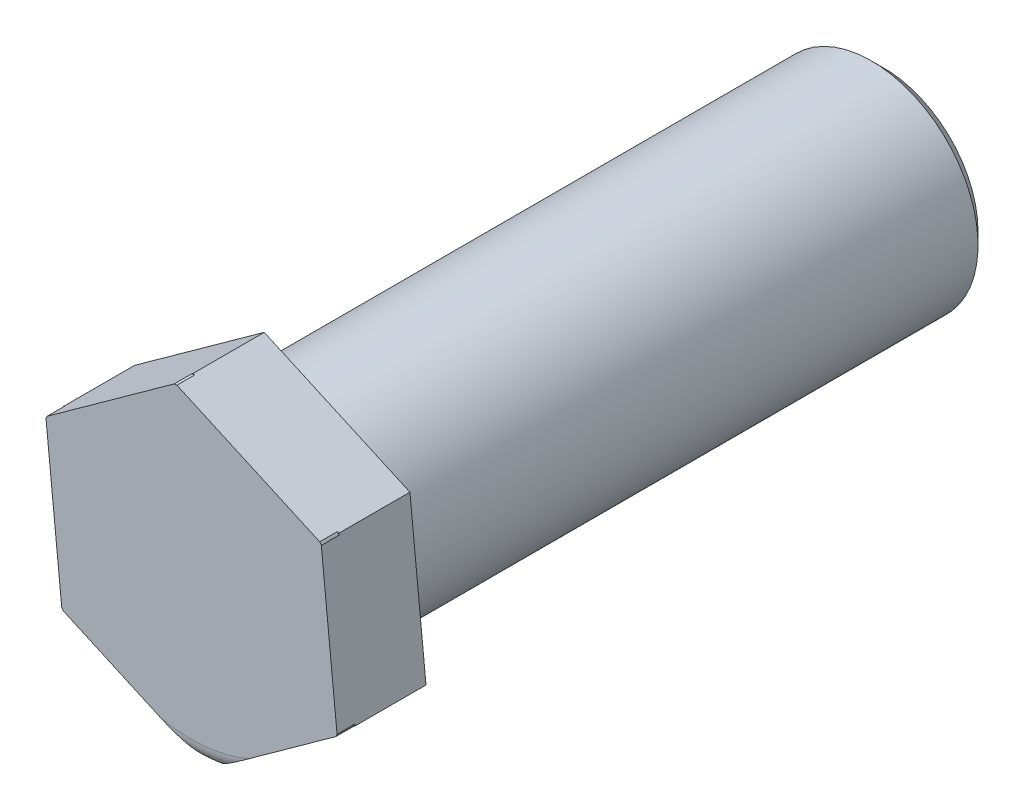
ISO-10303-21;
HEADER;
FILE_DESCRIPTION(('STEP AP214'),'2;1');
FILE_NAME('part.step','',(''),(''),'','','');
FILE_SCHEMA(('AUTOMOTIVE_DESIGN { 1 0 10303 214 1 1 1 1 }'));
ENDSEC;
DATA;
#1=APPLICATION_CONTEXT('core data for automotive mechanical design processes');
#2=APPLICATION_PROTOCOL_DEFINITION('international standard','automotive_design',2000,#1);
#3=PRODUCT_CONTEXT('',#1,'mechanical');
#4=PRODUCT('Part','Part','',(#3));
#5=PRODUCT_RELATED_PRODUCT_CATEGORY('part','',(#4));
#6=PRODUCT_DEFINITION_FORMATION('','',#4);
#7=PRODUCT_DEFINITION_CONTEXT('part definition',#1,'design');
#8=PRODUCT_DEFINITION('design','',#6,#7);
#9=PRODUCT_DEFINITION_SHAPE('','',#8);
#10=(LENGTH_UNIT() NAMED_UNIT(*) SI_UNIT(.MILLI.,.METRE.));
#11=(NAMED_UNIT(*) PLANE_ANGLE_UNIT() SI_UNIT($,.RADIAN.));
#12=(NAMED_UNIT(*) SI_UNIT($,.STERADIAN.) SOLID_ANGLE_UNIT());
#13=UNCERTAINTY_MEASURE_WITH_UNIT(LENGTH_MEASURE(1.E-05),#10,'distance_accuracy_value','');
#14=(GEOMETRIC_REPRESENTATION_CONTEXT(3) GLOBAL_UNCERTAINTY_ASSIGNED_CONTEXT((#13)) GLOBAL_UNIT_ASSIGNED_CONTEXT((#10,
#11,#12)) REPRESENTATION_CONTEXT('',''));
#15=CARTESIAN_POINT('',(0.,0.,0.));
#16=DIRECTION('',(0.,0.,1.));
#17=DIRECTION('',(1.,0.,0.));
#18=AXIS2_PLACEMENT_3D('',#15,#16,#17);
#19=CARTESIAN_POINT('',(-8.009387512,-8.049850553,39.));
#20=DIRECTION('',(0.,0.,1.));
#21=DIRECTION('',(1.,0.,0.));
#22=AXIS2_PLACEMENT_3D('',#19,#20,#21);
#23=PLANE('',#22);
#24=DIRECTION('',(0.811367672669099,0.584536140668419,0.));
#25=VECTOR('',#24,1.);
#26=CARTESIAN_POINT('',(4.556008325,-6.323985147,39.));
#27=LINE('',#26,#25);
#28=CARTESIAN_POINT('',(3.26737763687939,-7.25235736905686,39.));
#29=VERTEX_POINT('',#28);
#30=CARTESIAN_POINT('',(8.1325884081249,-3.74729841297728,39.));
#31=VERTEX_POINT('',#30);
#32=EDGE_CURVE('E407',#29,#31,#27,.T.);
#33=ORIENTED_EDGE('',*,*,#32,.T.);
#34=CARTESIAN_POINT('',(0.000157298073144921,-7.078497796199E-05,39.));
#35=DIRECTION('',(0.,0.,1.));
#36=DIRECTION('',(1.,0.,0.));
#37=AXIS2_PLACEMENT_3D('',#34,#35,#36);
#38=CIRCLE('',#37,8.95422529623747);
#39=CARTESIAN_POINT('',(8.19792208060346,-3.60212620183162,39.));
#40=VERTEX_POINT('',#39);
#41=EDGE_CURVE('E205',#31,#40,#38,.T.);
#42=ORIENTED_EDGE('',*,*,#41,.T.);
#43=DIRECTION('',(-0.100539310889991,0.994933086677574,0.));
#44=VECTOR('',#43,1.);
#45=CARTESIAN_POINT('',(7.754735953,0.783626375999999,39.));
#46=LINE('',#45,#44);
#47=CARTESIAN_POINT('',(7.31154982540417,5.16937895375605,39.));
#48=VERTEX_POINT('',#47);
#49=EDGE_CURVE('E200',#40,#48,#46,.T.);
#50=ORIENTED_EDGE('',*,*,#49,.T.);
#51=CARTESIAN_POINT('',(0.000139954270434936,0.000100831606586818,39.));
#52=DIRECTION('',(0.,0.,1.));
#53=DIRECTION('',(1.,0.,0.));
#54=AXIS2_PLACEMENT_3D('',#51,#52,#53);
#55=CIRCLE('',#54,8.95422529356085);
#56=CARTESIAN_POINT('',(7.21849383891172,5.2985456792887,39.));
#57=VERTEX_POINT('',#56);
#58=EDGE_CURVE('E251',#48,#57,#55,.T.);
#59=ORIENTED_EDGE('',*,*,#58,.T.);
#60=DIRECTION('',(-0.911906983581308,0.41039694601159,0.));
#61=VECTOR('',#60,1.);
#62=CARTESIAN_POINT('',(3.198727628,7.107611523,39.));
#63=LINE('',#62,#61);
#64=CARTESIAN_POINT('',(-0.821038582741133,8.91667736663453,39.));
#65=VERTEX_POINT('',#64);
#66=EDGE_CURVE('E385',#57,#65,#63,.T.);
#67=ORIENTED_EDGE('',*,*,#66,.T.);
#68=CARTESIAN_POINT('',(-1.73431466395178E-05,0.000171618238477972,39.));
#69=DIRECTION('',(0.,0.,1.));
#70=DIRECTION('',(1.,0.,0.));
#71=AXIS2_PLACEMENT_3D('',#68,#69,#70);
#72=CIRCLE('',#71,8.95422529519138);
#73=CARTESIAN_POINT('',(-0.979428241813012,8.90067188106746,39.));
#74=VERTEX_POINT('',#73);
#75=EDGE_CURVE('E235',#65,#74,#72,.T.);
#76=ORIENTED_EDGE('',*,*,#75,.T.);
#77=DIRECTION('',(-0.811367672669099,-0.584536140668419,0.));
#78=VECTOR('',#77,1.);
#79=CARTESIAN_POINT('',(-4.556008325,6.323985147,39.));
#80=LINE('',#79,#78);
#81=CARTESIAN_POINT('',(-8.1325884081251,3.74729841297714,39.));
#82=VERTEX_POINT('',#81);
#83=EDGE_CURVE('E380',#74,#82,#80,.T.);
#84=ORIENTED_EDGE('',*,*,#83,.T.);
#85=CARTESIAN_POINT('',(-0.000157298049743501,7.07849747614252E-05,39.));
#86=DIRECTION('',(0.,0.,1.));
#87=DIRECTION('',(1.,0.,0.));
#88=AXIS2_PLACEMENT_3D('',#85,#86,#87);
#89=CIRCLE('',#88,8.95422529626018);
#90=CARTESIAN_POINT('',(-8.19792208060346,3.60212620183161,39.));
#91=VERTEX_POINT('',#90);
#92=EDGE_CURVE('E219',#82,#91,#89,.T.);
#93=ORIENTED_EDGE('',*,*,#92,.T.);
#94=DIRECTION('',(0.100539310889991,-0.994933086677574,0.));
#95=VECTOR('',#94,1.);
#96=CARTESIAN_POINT('',(-7.754735953,-0.783626375999999,39.));
#97=LINE('',#96,#95);
#98=CARTESIAN_POINT('',(-7.31154982540417,-5.16937895375605,39.));
#99=VERTEX_POINT('',#98);
#100=EDGE_CURVE('E365',#91,#99,#97,.T.);
#101=ORIENTED_EDGE('',*,*,#100,.T.);
#102=CARTESIAN_POINT('',(-0.00013995427044361,-0.00010083160657294,39.));
#103=DIRECTION('',(0.,0.,1.));
#104=DIRECTION('',(1.,0.,0.));
#105=AXIS2_PLACEMENT_3D('',#102,#103,#104);
#106=CIRCLE('',#105,8.95422529356086);
#107=CARTESIAN_POINT('',(-7.21849383891172,-5.29854567928869,39.));
#108=VERTEX_POINT('',#107);
#109=EDGE_CURVE('E202',#99,#108,#106,.T.);
#110=ORIENTED_EDGE('',*,*,#109,.T.);
#111=DIRECTION('',(0.911906983581308,-0.41039694601159,0.));
#112=VECTOR('',#111,1.);
#113=CARTESIAN_POINT('',(-3.198727628,-7.107611523,39.));
#114=LINE('',#113,#112);
#115=CARTESIAN_POINT('',(-1.75041835452084,-7.75941232600362,38.999999999918));
#116=VERTEX_POINT('',#115);
#117=EDGE_CURVE('E364',#108,#116,#114,.T.);
#118=ORIENTED_EDGE('',*,*,#117,.T.);
#119=CARTESIAN_POINT('',(3.29542684679332,-7.23965509901735,38.999999999795));
#120=CARTESIAN_POINT('',(1.69117410930716,-7.96989672902473,38.9999999997949));
#121=CARTESIAN_POINT('',(-0.062529078032489,-8.14711076682736,38.9999999997949));
#122=CARTESIAN_POINT('',(-1.78044172707016,-7.75257836517985,38.999999999795));
#123=(BOUNDED_CURVE() B_SPLINE_CURVE(3,(#119,#120,#121,#122),.UNSPECIFIED.,.F.,
.F.) B_SPLINE_CURVE_WITH_KNOTS((4,4),(0.,1.),
.UNSPECIFIED.) CURVE() GEOMETRIC_REPRESENTATION_ITEM() RATIONAL_B_SPLINE_CURVE((0.956578302165924,
0.92289766729745,0.92289766729745,0.956578302165924)) REPRESENTATION_ITEM(''));
#124=EDGE_CURVE('E290',#29,#116,#123,.T.);
#125=ORIENTED_EDGE('',*,*,#124,.F.);
#126=EDGE_LOOP('',(#33,#42,#50,#59,#67,#76,#84,#93,#101,#110,#118,#125));
#127=FACE_BOUND('',#126,.T.);
#128=ADVANCED_FACE('F58',(#127),#23,.T.);
#129=CARTESIAN_POINT('',(7.302309054,5.260825266,34.));
#130=DIRECTION('',(-0.994933086677574,-0.100539310889991,0.));
#131=DIRECTION('',(0.100539310889991,-0.994933086677574,0.));
#132=AXIS2_PLACEMENT_3D('',#129,#130,#131);
#133=PLANE('',#132);
#134=DIRECTION('',(0.,0.,1.));
#135=VECTOR('',#134,1.);
#136=CARTESIAN_POINT('',(8.19792208060346,-3.60212620183162,38.));
#137=LINE('',#136,#135);
#138=CARTESIAN_POINT('',(8.19792208060346,-3.60212620183162,38.));
#139=VERTEX_POINT('',#138);
#140=EDGE_CURVE('E185',#139,#40,#137,.T.);
#141=ORIENTED_EDGE('',*,*,#140,.F.);
#142=DIRECTION('',(0.100539310889996,-0.994933086677574,0.));
#143=VECTOR('',#142,1.);
#144=CARTESIAN_POINT('',(8.47900147885009,-6.38367692884,38.));
#145=LINE('',#144,#143);
#146=CARTESIAN_POINT('',(8.207162852,-3.69357251400001,38.));
#147=VERTEX_POINT('',#146);
#148=EDGE_CURVE('E189',#139,#147,#145,.T.);
#149=ORIENTED_EDGE('',*,*,#148,.T.);
#150=DIRECTION('',(0.,0.,-1.));
#151=VECTOR('',#150,1.);
#152=CARTESIAN_POINT('',(8.207162852,-3.693572514,36.5));
#153=LINE('',#152,#151);
#154=CARTESIAN_POINT('',(8.207162852,-3.693572514,34.));
#155=VERTEX_POINT('',#154);
#156=EDGE_CURVE('E401',#147,#155,#153,.T.);
#157=ORIENTED_EDGE('',*,*,#156,.T.);
#158=DIRECTION('',(0.100539310889991,-0.994933086677574,0.));
#159=VECTOR('',#158,1.);
#160=CARTESIAN_POINT('',(8.207162852,-3.693572514,34.));
#161=LINE('',#160,#159);
#162=CARTESIAN_POINT('',(7.302309054,5.260825266,34.));
#163=VERTEX_POINT('',#162);
#164=EDGE_CURVE('E277',#163,#155,#161,.T.);
#165=ORIENTED_EDGE('',*,*,#164,.F.);
#166=DIRECTION('',(0.,0.,1.));
#167=VECTOR('',#166,1.);
#168=CARTESIAN_POINT('',(7.302309054,5.260825266,36.5));
#169=LINE('',#168,#167);
#170=CARTESIAN_POINT('',(7.302309054,5.260825266,38.));
#171=VERTEX_POINT('',#170);
#172=EDGE_CURVE('E381',#163,#171,#169,.T.);
#173=ORIENTED_EDGE('',*,*,#172,.T.);
#174=DIRECTION('',(0.100539310889966,-0.994933086677577,0.));
#175=VECTOR('',#174,1.);
#176=CARTESIAN_POINT('',(8.47900147884983,-6.38367692884054,38.));
#177=LINE('',#176,#175);
#178=CARTESIAN_POINT('',(7.31154982540417,5.16937895375605,38.));
#179=VERTEX_POINT('',#178);
#180=EDGE_CURVE('E252',#171,#179,#177,.T.);
#181=ORIENTED_EDGE('',*,*,#180,.T.);
#182=DIRECTION('',(0.,0.,1.));
#183=VECTOR('',#182,1.);
#184=CARTESIAN_POINT('',(7.31154982540417,5.16937895375605,38.));
#185=LINE('',#184,#183);
#186=EDGE_CURVE('E264',#179,#48,#185,.T.);
#187=ORIENTED_EDGE('',*,*,#186,.T.);
#188=ORIENTED_EDGE('',*,*,#49,.F.);
#189=EDGE_LOOP('',(#141,#149,#157,#165,#173,#181,#187,#188));
#190=FACE_BOUND('',#189,.T.);
#191=ADVANCED_FACE('F198',(#190),#133,.F.);
#192=CARTESIAN_POINT('',(8.207162852,-3.693572514,34.));
#193=DIRECTION('',(-0.584536140668419,0.811367672669099,0.));
#194=DIRECTION('',(-0.811367672669099,-0.584536140668419,0.));
#195=AXIS2_PLACEMENT_3D('',#192,#193,#194);
#196=PLANE('',#195);
#197=DIRECTION('',(0.,0.,1.));
#198=VECTOR('',#197,1.);
#199=CARTESIAN_POINT('',(8.1325884081249,-3.74729841297728,38.));
#200=LINE('',#199,#198);
#201=CARTESIAN_POINT('',(8.1325884081249,-3.74729841297727,38.));
#202=VERTEX_POINT('',#201);
#203=EDGE_CURVE('E73',#202,#31,#200,.T.);
#204=ORIENTED_EDGE('',*,*,#203,.T.);
#205=ORIENTED_EDGE('',*,*,#32,.F.);
#206=CARTESIAN_POINT('',(0.979428242731035,-8.90067188040608,38.0000000000533));
#207=CARTESIAN_POINT('',(0.979425633032541,-8.9006737605193,38.014788920448));
#208=CARTESIAN_POINT('',(0.979969414525822,-8.90028200232366,38.0295695629035));
#209=CARTESIAN_POINT('',(0.98212158157896,-8.89873150990734,38.05900084571));
#210=CARTESIAN_POINT('',(0.983729098289144,-8.89757340163475,38.0736515822782));
#211=CARTESIAN_POINT('',(0.990066417531165,-8.89300778698593,38.1170017067394));
#212=CARTESIAN_POINT('',(0.996312165172983,-8.88850814355039,38.1453808139911));
#213=CARTESIAN_POINT('',(1.01232818172585,-8.87696967483879,38.2004442718461));
#214=CARTESIAN_POINT('',(1.02208801142484,-8.86993837031681,38.2271333696602));
#215=CARTESIAN_POINT('',(1.04452514937075,-8.85377391311161,38.2786272047681));
#216=CARTESIAN_POINT('',(1.05720929251692,-8.84463583634061,38.3034273435172));
#217=CARTESIAN_POINT('',(1.09433305360911,-8.81789064945815,38.3672065582918));
#218=CARTESIAN_POINT('',(1.12088761244519,-8.79875986589103,38.4043113453115));
#219=CARTESIAN_POINT('',(1.17829141626187,-8.7574042646353,38.4730617103803));
#220=CARTESIAN_POINT('',(1.20915229679591,-8.73517106430868,38.5046919595243));
#221=CARTESIAN_POINT('',(1.26974036343606,-8.69152141466478,38.5595839566573));
#222=CARTESIAN_POINT('',(1.29914545456201,-8.67033701323771,38.5833959852771));
#223=CARTESIAN_POINT('',(1.35951616358224,-8.62684395522123,38.6278317419776));
#224=CARTESIAN_POINT('',(1.39048303285253,-8.60453439709909,38.6484528577432));
#225=CARTESIAN_POINT('',(1.45357383530767,-8.55908169369339,38.6869495210793));
#226=CARTESIAN_POINT('',(1.48569963244356,-8.53593720555777,38.7048203778816));
#227=CARTESIAN_POINT('',(1.55074850812807,-8.48907384135401,38.7381359885566));
#228=CARTESIAN_POINT('',(1.58367132643036,-8.46535515277595,38.7535815223447));
#229=CARTESIAN_POINT('',(1.6629318965059,-8.40825321329798,38.7879200836759));
#230=CARTESIAN_POINT('',(1.70954523049949,-8.37467142384035,38.8058444892819));
#231=CARTESIAN_POINT('',(1.80354583627198,-8.3069502745148,38.8383214759682));
#232=CARTESIAN_POINT('',(1.85093345794859,-8.27281066256899,38.852872484831));
#233=CARTESIAN_POINT('',(1.99400719065209,-8.16973560749512,38.8923281403009));
#234=CARTESIAN_POINT('',(2.09046456424926,-8.10024452127027,38.912979141056));
#235=CARTESIAN_POINT('',(2.28464202595621,-7.96035264746959,38.946254560887));
#236=CARTESIAN_POINT('',(2.38236581216809,-7.88994919565855,38.9588430723013));
#237=CARTESIAN_POINT('',(2.57821194967258,-7.74885515255342,38.978190591727));
#238=CARTESIAN_POINT('',(2.67633443941398,-7.67816446151623,38.984947362786));
#239=CARTESIAN_POINT('',(2.85697757110969,-7.54802316725896,38.9936825438923));
#240=CARTESIAN_POINT('',(2.93948222515334,-7.48858408225916,38.9962525759535));
#241=CARTESIAN_POINT('',(3.10378753325744,-7.37021309716117,38.9993911875386));
#242=CARTESIAN_POINT('',(3.18558794759068,-7.31128136977038,38.9999772996942));
#243=CARTESIAN_POINT('',(3.26737763687939,-7.25235736905685,38.9999999997949));
#244=B_SPLINE_CURVE_WITH_KNOTS('',3,(#206,#207,#208,#209,#210,#211,#212,#213,#214,#215,#216,
#217,#218,#219,#220,#221,#222,#223,#224,#225,#226,#227,#228,#229,#230,#231,#232,#233,#234,#235,
#236,#237,#238,#239,#240,#241,#242,#243),.UNSPECIFIED.,.F.,.F.,(4,2,2,2,2,2,2,2,2,2,2,2,2,2,2,2,
2,2,4),(0.,0.0443360619671333,0.0886359552501318,0.176402211654985,0.263909865144776,
0.351624158850199,0.499200577961282,0.647183756621236,0.777088198032097,0.907098432405755,
1.03732800824513,1.16751561978541,1.34792540713905,1.52841910865494,1.88994702144957,
2.25307406453877,2.61634033491317,2.92147600488129,3.22390793745181),.UNSPECIFIED.);
#245=CARTESIAN_POINT('',(0.979428241434441,-8.90067188134019,38.));
#246=VERTEX_POINT('',#245);
#247=EDGE_CURVE('E338',#246,#29,#244,.T.);
#248=ORIENTED_EDGE('',*,*,#247,.F.);
#249=DIRECTION('',(-0.811367672669099,-0.584536140668419,0.));
#250=VECTOR('',#249,1.);
#251=CARTESIAN_POINT('',(0.904853798,-8.95439778,38.));
#252=LINE('',#251,#250);
#253=CARTESIAN_POINT('',(0.904853798,-8.95439778,38.));
#254=VERTEX_POINT('',#253);
#255=EDGE_CURVE('E266',#246,#254,#252,.T.);
#256=ORIENTED_EDGE('',*,*,#255,.T.);
#257=DIRECTION('',(0.,0.,1.));
#258=VECTOR('',#257,1.);
#259=CARTESIAN_POINT('',(0.904853798,-8.95439778,34.));
#260=LINE('',#259,#258);
#261=CARTESIAN_POINT('',(0.904853798,-8.95439778,34.));
#262=VERTEX_POINT('',#261);
#263=EDGE_CURVE('E285',#262,#254,#260,.T.);
#264=ORIENTED_EDGE('',*,*,#263,.F.);
#265=DIRECTION('',(-0.811367672669099,-0.584536140668419,0.));
#266=VECTOR('',#265,1.);
#267=CARTESIAN_POINT('',(0.904853798,-8.95439778,34.));
#268=LINE('',#267,#266);
#269=EDGE_CURVE('E280',#155,#262,#268,.T.);
#270=ORIENTED_EDGE('',*,*,#269,.F.);
#271=ORIENTED_EDGE('',*,*,#156,.F.);
#272=DIRECTION('',(-0.811367672669146,-0.584536140668354,0.));
#273=VECTOR('',#272,1.);
#274=CARTESIAN_POINT('',(-4.53454427230547,-12.8731202811257,38.));
#275=LINE('',#274,#273);
#276=EDGE_CURVE('E190',#147,#202,#275,.T.);
#277=ORIENTED_EDGE('',*,*,#276,.T.);
#278=EDGE_LOOP('',(#204,#205,#248,#256,#264,#270,#271,#277));
#279=FACE_BOUND('',#278,.T.);
#280=ADVANCED_FACE('F536',(#279),#196,.F.);
#281=CARTESIAN_POINT('',(-7.302309054,-5.260825266,34.));
#282=DIRECTION('',(0.994933086677574,0.100539310889991,0.));
#283=DIRECTION('',(-0.100539310889991,0.994933086677574,0.));
#284=AXIS2_PLACEMENT_3D('',#281,#282,#283);
#285=PLANE('',#284);
#286=DIRECTION('',(0.,0.,1.));
#287=VECTOR('',#286,1.);
#288=CARTESIAN_POINT('',(-7.31154982540417,-5.16937895375605,38.));
#289=LINE('',#288,#287);
#290=CARTESIAN_POINT('',(-7.31154982540417,-5.16937895375605,38.));
#291=VERTEX_POINT('',#290);
#292=EDGE_CURVE('E216',#291,#99,#289,.T.);
#293=ORIENTED_EDGE('',*,*,#292,.T.);
#294=ORIENTED_EDGE('',*,*,#100,.F.);
#295=DIRECTION('',(0.,0.,1.));
#296=VECTOR('',#295,1.);
#297=CARTESIAN_POINT('',(-8.19792208060346,3.60212620183161,38.));
#298=LINE('',#297,#296);
#299=CARTESIAN_POINT('',(-8.19792208060346,3.60212620183161,38.));
#300=VERTEX_POINT('',#299);
#301=EDGE_CURVE('E228',#300,#91,#298,.T.);
#302=ORIENTED_EDGE('',*,*,#301,.F.);
#303=DIRECTION('',(-0.100539310889996,0.994933086677574,0.));
#304=VECTOR('',#303,1.);
#305=CARTESIAN_POINT('',(-7.03047042719554,-7.95092968038801,38.));
#306=LINE('',#305,#304);
#307=CARTESIAN_POINT('',(-8.207162852,3.693572514,38.));
#308=VERTEX_POINT('',#307);
#309=EDGE_CURVE('E225',#300,#308,#306,.T.);
#310=ORIENTED_EDGE('',*,*,#309,.T.);
#311=DIRECTION('',(0.,0.,1.));
#312=VECTOR('',#311,1.);
#313=CARTESIAN_POINT('',(-8.207162852,3.693572514,36.5));
#314=LINE('',#313,#312);
#315=CARTESIAN_POINT('',(-8.207162852,3.693572514,34.));
#316=VERTEX_POINT('',#315);
#317=EDGE_CURVE('E354',#316,#308,#314,.T.);
#318=ORIENTED_EDGE('',*,*,#317,.F.);
#319=DIRECTION('',(-0.100539310889991,0.994933086677574,0.));
#320=VECTOR('',#319,1.);
#321=CARTESIAN_POINT('',(-8.207162852,3.693572514,34.));
#322=LINE('',#321,#320);
#323=CARTESIAN_POINT('',(-7.302309054,-5.260825266,34.));
#324=VERTEX_POINT('',#323);
#325=EDGE_CURVE('E267',#324,#316,#322,.T.);
#326=ORIENTED_EDGE('',*,*,#325,.F.);
#327=DIRECTION('',(0.,0.,1.));
#328=VECTOR('',#327,1.);
#329=CARTESIAN_POINT('',(-7.302309054,-5.260825266,36.5));
#330=LINE('',#329,#328);
#331=CARTESIAN_POINT('',(-7.302309054,-5.260825266,38.));
#332=VERTEX_POINT('',#331);
#333=EDGE_CURVE('E366',#324,#332,#330,.T.);
#334=ORIENTED_EDGE('',*,*,#333,.T.);
#335=DIRECTION('',(-0.100539310889958,0.994933086677578,0.));
#336=VECTOR('',#335,1.);
#337=CARTESIAN_POINT('',(-7.03047042719569,-7.95092968038807,38.));
#338=LINE('',#337,#336);
#339=EDGE_CURVE('E81',#332,#291,#338,.T.);
#340=ORIENTED_EDGE('',*,*,#339,.T.);
#341=EDGE_LOOP('',(#293,#294,#302,#310,#318,#326,#334,#340));
#342=FACE_BOUND('',#341,.T.);
#343=ADVANCED_FACE('F533',(#342),#285,.F.);
#344=CARTESIAN_POINT('',(0.904853798,-8.95439778,34.));
#345=DIRECTION('',(0.41039694601159,0.911906983581308,0.));
#346=DIRECTION('',(-0.911906983581308,0.41039694601159,0.));
#347=AXIS2_PLACEMENT_3D('',#344,#345,#346);
#348=PLANE('',#347);
#349=DIRECTION('',(0.,0.,1.));
#350=VECTOR('',#349,1.);
#351=CARTESIAN_POINT('',(-7.21849383891172,-5.29854567928869,38.));
#352=LINE('',#351,#350);
#353=CARTESIAN_POINT('',(-7.21849383891172,-5.29854567928869,38.));
#354=VERTEX_POINT('',#353);
#355=EDGE_CURVE('E212',#354,#108,#352,.T.);
#356=ORIENTED_EDGE('',*,*,#355,.F.);
#357=DIRECTION('',(-0.911906983581309,0.410396946011588,0.));
#358=VECTOR('',#357,1.);
#359=CARTESIAN_POINT('',(-6.84652182442471,-5.4659489139341,38.));
#360=LINE('',#359,#358);
#361=EDGE_CURVE('E210',#354,#332,#360,.T.);
#362=ORIENTED_EDGE('',*,*,#361,.T.);
#363=ORIENTED_EDGE('',*,*,#333,.F.);
#364=DIRECTION('',(-0.911906983581308,0.41039694601159,0.));
#365=VECTOR('',#364,1.);
#366=CARTESIAN_POINT('',(-7.302309054,-5.260825266,34.));
#367=LINE('',#366,#365);
#368=EDGE_CURVE('E282',#262,#324,#367,.T.);
#369=ORIENTED_EDGE('',*,*,#368,.F.);
#370=ORIENTED_EDGE('',*,*,#263,.T.);
#371=DIRECTION('',(-0.911906983581308,0.41039694601159,0.));
#372=VECTOR('',#371,1.);
#373=CARTESIAN_POINT('',(-7.302309054,-5.260825266,38.));
#374=LINE('',#373,#372);
#375=CARTESIAN_POINT('',(0.821038581755394,-8.91667736619091,38.));
#376=VERTEX_POINT('',#375);
#377=EDGE_CURVE('E271',#254,#376,#374,.T.);
#378=ORIENTED_EDGE('',*,*,#377,.T.);
#379=CARTESIAN_POINT('',(-1.75041835392708,-7.75941232468428,38.999999999795));
#380=CARTESIAN_POINT('',(-1.67595060108267,-7.79292598221069,38.9999901350199));
#381=CARTESIAN_POINT('',(-1.60147714143842,-7.82644220803987,38.9996005938681));
#382=CARTESIAN_POINT('',(-1.45173094771398,-7.89383436720508,38.9976289262371));
#383=CARTESIAN_POINT('',(-1.37645836568892,-7.92771023210982,38.996033823979));
#384=CARTESIAN_POINT('',(-1.22546541220144,-7.99566348622042,38.9911835925434));
#385=CARTESIAN_POINT('',(-1.14974530264792,-8.02974075755613,38.9879177644975));
#386=CARTESIAN_POINT('',(-0.99821453118489,-8.09793605264092,38.9791789275986));
#387=CARTESIAN_POINT('',(-0.922404125106348,-8.13205396125518,38.9737003535992));
#388=CARTESIAN_POINT('',(-0.768482320446572,-8.20132532302157,38.9596869491173));
#389=CARTESIAN_POINT('',(-0.690377881479991,-8.23647564405097,38.9510568957082));
#390=CARTESIAN_POINT('',(-0.534797022223603,-8.30649365098182,38.9299818889497));
#391=CARTESIAN_POINT('',(-0.457319477585115,-8.34136184288801,38.9175472629163));
#392=CARTESIAN_POINT('',(-0.303391465989025,-8.41063599803986,38.8878887850481));
#393=CARTESIAN_POINT('',(-0.226938377434088,-8.44504314111588,38.870681607568));
#394=CARTESIAN_POINT('',(-0.0754572470578749,-8.51321609559928,38.8301888155827));
#395=CARTESIAN_POINT('',(-0.000427018145132953,-8.54698289129089,38.8069135076357));
#396=CARTESIAN_POINT('',(0.0993110070762028,-8.59186924668572,38.7701802572146));
#397=CARTESIAN_POINT('',(0.125077584866072,-8.60346530310872,38.7601534178492));
#398=CARTESIAN_POINT('',(0.176238264840317,-8.62648978608268,38.7390361612078));
#399=CARTESIAN_POINT('',(0.201632449671278,-8.63791824982813,38.7279459841708));
#400=CARTESIAN_POINT('',(0.277129223484953,-8.67189501057754,38.6929302657591));
#401=CARTESIAN_POINT('',(0.32657697743016,-8.69414860395012,38.6672484514313));
#402=CARTESIAN_POINT('',(0.423159659531829,-8.7376149206752,38.6099446022532));
#403=CARTESIAN_POINT('',(0.470268781599794,-8.75881603018978,38.578269510657));
#404=CARTESIAN_POINT('',(0.5598788211751,-8.79914436107848,38.5078951748295));
#405=CARTESIAN_POINT('',(0.602394318913509,-8.818278144177,38.4692192637298));
#406=CARTESIAN_POINT('',(0.663586929836013,-8.84581742295576,38.4015474291066));
#407=CARTESIAN_POINT('',(0.684780451000455,-8.85535540930503,38.3753006147931));
#408=CARTESIAN_POINT('',(0.723732490421118,-8.87288548452875,38.3198324259151));
#409=CARTESIAN_POINT('',(0.741490010556744,-8.88087712420646,38.2906101907746));
#410=CARTESIAN_POINT('',(0.772623725294239,-8.89488862063791,38.228938861002));
#411=CARTESIAN_POINT('',(0.785940836576924,-8.90088188738391,38.1964532027045));
#412=CARTESIAN_POINT('',(0.806550705970366,-8.91015720560058,38.1292907460142));
#413=CARTESIAN_POINT('',(0.813865451675919,-8.91344915242452,38.0946224502622));
#414=CARTESIAN_POINT('',(0.818843534631244,-8.91568950158157,38.0496784194445));
#415=CARTESIAN_POINT('',(0.819665572892437,-8.91605945377846,38.0397636432412));
#416=CARTESIAN_POINT('',(0.820762515178574,-8.91655312448411,38.0199009577448));
#417=CARTESIAN_POINT('',(0.821037594825766,-8.91667692203035,38.0099530601147));
#418=CARTESIAN_POINT('',(0.821038581755513,-8.91667736619035,38.0000000000534));
#419=B_SPLINE_CURVE_WITH_KNOTS('',3,(#379,#380,#381,#382,#383,#384,#385,#386,#387,#388,#389,
#390,#391,#392,#393,#394,#395,#396,#397,#398,#399,#400,#401,#402,#403,#404,#405,#406,#407,#408,
#409,#410,#411,#412,#413,#414,#415,#416,#417,#418),.UNSPECIFIED.,.F.,.F.,(4,2,2,2,2,2,2,2,2,2,2,
2,2,2,2,2,2,2,2,4),(0.,0.244993508103211,0.492662179458741,0.741937084315389,0.991842868965388,
1.25002640059033,1.50751523214694,1.76411554118095,2.02028282900976,2.11021023029316,
2.20011736202544,2.37982482106064,2.56120467524554,2.74199077887207,2.84690800018013,
2.95185565318511,3.0581486534019,3.16405052549598,3.19390451559775,3.22374891837081),.UNSPECIFIED.);
#420=EDGE_CURVE('E339',#116,#376,#419,.T.);
#421=ORIENTED_EDGE('',*,*,#420,.F.);
#422=ORIENTED_EDGE('',*,*,#117,.F.);
#423=EDGE_LOOP('',(#356,#362,#363,#369,#370,#378,#421,#422));
#424=FACE_BOUND('',#423,.T.);
#425=ADVANCED_FACE('F453',(#424),#348,.F.);
#426=CARTESIAN_POINT('',(-8.207162852,3.693572514,34.));
#427=DIRECTION('',(0.584536140668419,-0.811367672669099,0.));
#428=DIRECTION('',(0.811367672669099,0.584536140668419,0.));
#429=AXIS2_PLACEMENT_3D('',#426,#427,#428);
#430=PLANE('',#429);
#431=DIRECTION('',(0.,0.,1.));
#432=VECTOR('',#431,1.);
#433=CARTESIAN_POINT('',(-8.1325884081251,3.74729841297714,38.));
#434=LINE('',#433,#432);
#435=CARTESIAN_POINT('',(-8.1325884081251,3.74729841297714,38.));
#436=VERTEX_POINT('',#435);
#437=EDGE_CURVE('E232',#436,#82,#434,.T.);
#438=ORIENTED_EDGE('',*,*,#437,.T.);
#439=ORIENTED_EDGE('',*,*,#83,.F.);
#440=DIRECTION('',(0.,0.,1.));
#441=VECTOR('',#440,1.);
#442=CARTESIAN_POINT('',(-0.979428241813012,8.90067188106746,38.));
#443=LINE('',#442,#441);
#444=CARTESIAN_POINT('',(-0.979428241813012,8.90067188106746,38.));
#445=VERTEX_POINT('',#444);
#446=EDGE_CURVE('E244',#445,#74,#443,.T.);
#447=ORIENTED_EDGE('',*,*,#446,.F.);
#448=DIRECTION('',(0.811367672669099,0.584536140668419,0.));
#449=VECTOR('',#448,1.);
#450=CARTESIAN_POINT('',(-13.6465609225567,-0.225149987308165,38.));
#451=LINE('',#450,#449);
#452=CARTESIAN_POINT('',(-0.904853798,8.95439778,38.));
#453=VERTEX_POINT('',#452);
#454=EDGE_CURVE('E241',#445,#453,#451,.T.);
#455=ORIENTED_EDGE('',*,*,#454,.T.);
#456=DIRECTION('',(0.,0.,1.));
#457=VECTOR('',#456,1.);
#458=CARTESIAN_POINT('',(-0.904853798,8.95439778,36.5));
#459=LINE('',#458,#457);
#460=CARTESIAN_POINT('',(-0.904853798,8.95439778,34.));
#461=VERTEX_POINT('',#460);
#462=EDGE_CURVE('E376',#461,#453,#459,.T.);
#463=ORIENTED_EDGE('',*,*,#462,.F.);
#464=DIRECTION('',(0.811367672669099,0.584536140668419,0.));
#465=VECTOR('',#464,1.);
#466=CARTESIAN_POINT('',(-0.904853798,8.95439778,34.));
#467=LINE('',#466,#465);
#468=EDGE_CURVE('E270',#316,#461,#467,.T.);
#469=ORIENTED_EDGE('',*,*,#468,.F.);
#470=ORIENTED_EDGE('',*,*,#317,.T.);
#471=DIRECTION('',(0.811367672669147,0.584536140668353,0.));
#472=VECTOR('',#471,1.);
#473=CARTESIAN_POINT('',(-13.6465609225564,-0.225149987307258,38.));
#474=LINE('',#473,#472);
#475=EDGE_CURVE('E220',#308,#436,#474,.T.);
#476=ORIENTED_EDGE('',*,*,#475,.T.);
#477=EDGE_LOOP('',(#438,#439,#447,#455,#463,#469,#470,#476));
#478=FACE_BOUND('',#477,.T.);
#479=ADVANCED_FACE('F507',(#478),#430,.F.);
#480=CARTESIAN_POINT('',(-0.904853798,8.95439778,34.));
#481=DIRECTION('',(-0.41039694601159,-0.911906983581308,0.));
#482=DIRECTION('',(0.911906983581308,-0.41039694601159,0.));
#483=AXIS2_PLACEMENT_3D('',#480,#481,#482);
#484=PLANE('',#483);
#485=DIRECTION('',(0.,0.,1.));
#486=VECTOR('',#485,1.);
#487=CARTESIAN_POINT('',(-0.821038582741133,8.91667736663453,38.));
#488=LINE('',#487,#486);
#489=CARTESIAN_POINT('',(-0.821038582741133,8.91667736663453,38.));
#490=VERTEX_POINT('',#489);
#491=EDGE_CURVE('E248',#490,#65,#488,.T.);
#492=ORIENTED_EDGE('',*,*,#491,.T.);
#493=ORIENTED_EDGE('',*,*,#66,.F.);
#494=DIRECTION('',(0.,0.,1.));
#495=VECTOR('',#494,1.);
#496=CARTESIAN_POINT('',(7.21849383891172,5.2985456792887,38.));
#497=LINE('',#496,#495);
#498=CARTESIAN_POINT('',(7.21849383891172,5.2985456792887,38.));
#499=VERTEX_POINT('',#498);
#500=EDGE_CURVE('E260',#499,#57,#497,.T.);
#501=ORIENTED_EDGE('',*,*,#500,.F.);
#502=DIRECTION('',(0.911906983581309,-0.410396946011588,0.));
#503=VECTOR('',#502,1.);
#504=CARTESIAN_POINT('',(-0.449066568555491,8.74927413212474,38.));
#505=LINE('',#504,#503);
#506=EDGE_CURVE('E257',#499,#171,#505,.T.);
#507=ORIENTED_EDGE('',*,*,#506,.T.);
#508=ORIENTED_EDGE('',*,*,#172,.F.);
#509=DIRECTION('',(0.911906983581308,-0.41039694601159,0.));
#510=VECTOR('',#509,1.);
#511=CARTESIAN_POINT('',(7.302309054,5.260825266,34.));
#512=LINE('',#511,#510);
#513=EDGE_CURVE('E274',#461,#163,#512,.T.);
#514=ORIENTED_EDGE('',*,*,#513,.F.);
#515=ORIENTED_EDGE('',*,*,#462,.T.);
#516=DIRECTION('',(0.911906983581293,-0.410396946011623,0.));
#517=VECTOR('',#516,1.);
#518=CARTESIAN_POINT('',(-0.449066568554856,8.74927413212445,38.));
#519=LINE('',#518,#517);
#520=EDGE_CURVE('E236',#453,#490,#519,.T.);
#521=ORIENTED_EDGE('',*,*,#520,.T.);
#522=EDGE_LOOP('',(#492,#493,#501,#507,#508,#514,#515,#521));
#523=FACE_BOUND('',#522,.T.);
#524=ADVANCED_FACE('F317',(#523),#484,.F.);
#525=CARTESIAN_POINT('',(-1.758095902,-7.655277927,38.995004165));
#526=CARTESIAN_POINT('',(-0.061744293,-8.044858663,38.995004165));
#527=CARTESIAN_POINT('',(1.669948657,-7.869868789,38.995004165));
#528=CARTESIAN_POINT('',(3.254066868,-7.148792217,38.995004165));
#529=CARTESIAN_POINT('',(-1.910275808,-8.317914974,39.063220423));
#530=CARTESIAN_POINT('',(-0.067088849,-8.741217625,39.063220423));
#531=CARTESIAN_POINT('',(1.814498582,-8.551080714,39.063220423));
#532=CARTESIAN_POINT('',(3.535737277,-7.767588113,39.063220423));
#533=CARTESIAN_POINT('',(-2.01842354,-8.788822701,38.580053765));
#534=CARTESIAN_POINT('',(-0.070886995,-9.23609007,38.580053765));
#535=CARTESIAN_POINT('',(1.917224013,-9.03518881,38.580053765));
#536=CARTESIAN_POINT('',(3.735908354,-8.207339814,38.580053765));
#537=CARTESIAN_POINT('',(-2.003154619,-8.72233723,37.900166583));
#538=CARTESIAN_POINT('',(-0.070350751,-9.166221122,37.900166583));
#539=CARTESIAN_POINT('',(1.902720644,-8.966839635,37.900166583));
#540=CARTESIAN_POINT('',(3.707647046,-8.14525313,37.900166583));
#541=(BOUNDED_SURFACE() B_SPLINE_SURFACE(3,3,((#525,#526,#527,#528),(#529,#530,#531,#532),(#533,
#534,#535,#536),(#537,#538,#539,#540)),.UNSPECIFIED.,.F.,.F.,
.F.) B_SPLINE_SURFACE_WITH_KNOTS((4,4),(4,4),(0.,1.),(0.,1.),
.UNSPECIFIED.) GEOMETRIC_REPRESENTATION_ITEM() RATIONAL_B_SPLINE_SURFACE(((1.,0.96479050926389,
0.96479050926389,1.),(0.755320871117971,0.728726407903553,0.728726407903553,0.755320871117971),
(0.755320871117971,0.728726407903553,0.728726407903553,0.755320871117971),(1.,0.96479050926389,
0.96479050926389,1.))) REPRESENTATION_ITEM('') SURFACE());
#542=CARTESIAN_POINT('',(0.979428240906144,-8.90067188060689,38.));
#543=CARTESIAN_POINT('',(0.900304553996091,-8.90937863607042,38.));
#544=CARTESIAN_POINT('',(0.821038584228951,-8.91667736596284,38.));
#545=B_SPLINE_CURVE_WITH_KNOTS('',2,(#542,#543,#544),.UNSPECIFIED.,.F.,.F.,(3,3),(0.,1.),.UNSPECIFIED.);
#546=EDGE_CURVE('E301',#376,#246,#545,.F.);
#547=ORIENTED_EDGE('',*,*,#420,.T.);
#548=ORIENTED_EDGE('',*,*,#546,.T.);
#549=ORIENTED_EDGE('',*,*,#247,.T.);
#550=ORIENTED_EDGE('',*,*,#124,.T.);
#551=EDGE_LOOP('',(#547,#548,#549,#550));
#552=FACE_BOUND('',#551,.T.);
#553=ADVANCED_FACE('F305',(#552),#541,.T.);
#554=CARTESIAN_POINT('',(0.,0.,34.));
#555=DIRECTION('',(0.,0.,1.));
#556=DIRECTION('',(1.,0.,0.));
#557=AXIS2_PLACEMENT_3D('',#554,#555,#556);
#558=PLANE('',#557);
#559=CARTESIAN_POINT('',(0.,0.,34.));
#560=DIRECTION('',(0.,0.,-1.));
#561=DIRECTION('',(-1.,0.,0.));
#562=AXIS2_PLACEMENT_3D('',#559,#560,#561);
#563=CIRCLE('',#562,6.);
#564=CARTESIAN_POINT('',(-6.,0.,34.));
#565=VERTEX_POINT('',#564);
#566=EDGE_CURVE('E677',#565,#565,#563,.T.);
#567=ORIENTED_EDGE('',*,*,#566,.F.);
#568=EDGE_LOOP('',(#567));
#569=FACE_BOUND('',#568,.T.);
#570=ORIENTED_EDGE('',*,*,#325,.T.);
#571=ORIENTED_EDGE('',*,*,#468,.T.);
#572=ORIENTED_EDGE('',*,*,#513,.T.);
#573=ORIENTED_EDGE('',*,*,#164,.T.);
#574=ORIENTED_EDGE('',*,*,#269,.T.);
#575=ORIENTED_EDGE('',*,*,#368,.T.);
#576=EDGE_LOOP('',(#570,#571,#572,#573,#574,#575));
#577=FACE_BOUND('',#576,.T.);
#578=ADVANCED_FACE('F316',(#569,#577),#558,.F.);
#579=CARTESIAN_POINT('',(0.,0.,38.));
#580=DIRECTION('',(0.,0.,1.));
#581=DIRECTION('',(1.,0.,0.));
#582=AXIS2_PLACEMENT_3D('',#579,#580,#581);
#583=PLANE('',#582);
#584=ORIENTED_EDGE('',*,*,#255,.F.);
#585=ORIENTED_EDGE('',*,*,#546,.F.);
#586=ORIENTED_EDGE('',*,*,#377,.F.);
#587=EDGE_LOOP('',(#584,#585,#586));
#588=FACE_BOUND('',#587,.T.);
#589=ADVANCED_FACE('F318',(#588),#583,.T.);
#590=CARTESIAN_POINT('',(0.000139954270434936,0.000100831606586818,38.));
#591=DIRECTION('',(0.,0.,1.));
#592=DIRECTION('',(1.,0.,0.));
#593=AXIS2_PLACEMENT_3D('',#590,#591,#592);
#594=CYLINDRICAL_SURFACE('',#593,8.95422529356085);
#595=ORIENTED_EDGE('',*,*,#58,.F.);
#596=ORIENTED_EDGE('',*,*,#186,.F.);
#597=CARTESIAN_POINT('',(0.000139954270434936,0.000100831606586818,38.));
#598=DIRECTION('',(0.,0.,1.));
#599=DIRECTION('',(1.,0.,0.));
#600=AXIS2_PLACEMENT_3D('',#597,#598,#599);
#601=CIRCLE('',#600,8.95422529356085);
#602=EDGE_CURVE('E255',#179,#499,#601,.T.);
#603=ORIENTED_EDGE('',*,*,#602,.T.);
#604=ORIENTED_EDGE('',*,*,#500,.T.);
#605=EDGE_LOOP('',(#595,#596,#603,#604));
#606=FACE_BOUND('',#605,.T.);
#607=ADVANCED_FACE('F615',(#606),#594,.T.);
#608=CARTESIAN_POINT('',(0.000139954270434936,0.000100831606586818,38.));
#609=DIRECTION('',(0.,0.,1.));
#610=DIRECTION('',(1.,0.,0.));
#611=AXIS2_PLACEMENT_3D('',#608,#609,#610);
#612=PLANE('',#611);
#613=ORIENTED_EDGE('',*,*,#180,.F.);
#614=ORIENTED_EDGE('',*,*,#506,.F.);
#615=ORIENTED_EDGE('',*,*,#602,.F.);
#616=EDGE_LOOP('',(#613,#614,#615));
#617=FACE_BOUND('',#616,.T.);
#618=ADVANCED_FACE('F608',(#617),#612,.T.);
#619=CARTESIAN_POINT('',(-1.73431466395178E-05,0.000171618238477972,38.));
#620=DIRECTION('',(0.,0.,1.));
#621=DIRECTION('',(1.,0.,0.));
#622=AXIS2_PLACEMENT_3D('',#619,#620,#621);
#623=CYLINDRICAL_SURFACE('',#622,8.95422529519138);
#624=ORIENTED_EDGE('',*,*,#75,.F.);
#625=ORIENTED_EDGE('',*,*,#491,.F.);
#626=CARTESIAN_POINT('',(-1.73431466395178E-05,0.000171618238477972,38.));
#627=DIRECTION('',(0.,0.,1.));
#628=DIRECTION('',(1.,0.,0.));
#629=AXIS2_PLACEMENT_3D('',#626,#627,#628);
#630=CIRCLE('',#629,8.95422529519138);
#631=EDGE_CURVE('E239',#490,#445,#630,.T.);
#632=ORIENTED_EDGE('',*,*,#631,.T.);
#633=ORIENTED_EDGE('',*,*,#446,.T.);
#634=EDGE_LOOP('',(#624,#625,#632,#633));
#635=FACE_BOUND('',#634,.T.);
#636=ADVANCED_FACE('F614',(#635),#623,.T.);
#637=CARTESIAN_POINT('',(-1.73431466395178E-05,0.000171618238477972,38.));
#638=DIRECTION('',(0.,0.,1.));
#639=DIRECTION('',(1.,0.,0.));
#640=AXIS2_PLACEMENT_3D('',#637,#638,#639);
#641=PLANE('',#640);
#642=ORIENTED_EDGE('',*,*,#520,.F.);
#643=ORIENTED_EDGE('',*,*,#454,.F.);
#644=ORIENTED_EDGE('',*,*,#631,.F.);
#645=EDGE_LOOP('',(#642,#643,#644));
#646=FACE_BOUND('',#645,.T.);
#647=ADVANCED_FACE('F718',(#646),#641,.T.);
#648=CARTESIAN_POINT('',(-0.000157298049743501,7.07849747614252E-05,38.));
#649=DIRECTION('',(0.,0.,1.));
#650=DIRECTION('',(1.,0.,0.));
#651=AXIS2_PLACEMENT_3D('',#648,#649,#650);
#652=CYLINDRICAL_SURFACE('',#651,8.95422529626018);
#653=ORIENTED_EDGE('',*,*,#92,.F.);
#654=ORIENTED_EDGE('',*,*,#437,.F.);
#655=CARTESIAN_POINT('',(-0.000157298049743501,7.07849747614252E-05,38.));
#656=DIRECTION('',(0.,0.,1.));
#657=DIRECTION('',(1.,0.,0.));
#658=AXIS2_PLACEMENT_3D('',#655,#656,#657);
#659=CIRCLE('',#658,8.95422529626018);
#660=EDGE_CURVE('E223',#436,#300,#659,.T.);
#661=ORIENTED_EDGE('',*,*,#660,.T.);
#662=ORIENTED_EDGE('',*,*,#301,.T.);
#663=EDGE_LOOP('',(#653,#654,#661,#662));
#664=FACE_BOUND('',#663,.T.);
#665=ADVANCED_FACE('F699',(#664),#652,.T.);
#666=CARTESIAN_POINT('',(-0.000157298049743501,7.07849747614252E-05,38.));
#667=DIRECTION('',(0.,0.,1.));
#668=DIRECTION('',(1.,0.,0.));
#669=AXIS2_PLACEMENT_3D('',#666,#667,#668);
#670=PLANE('',#669);
#671=ORIENTED_EDGE('',*,*,#475,.F.);
#672=ORIENTED_EDGE('',*,*,#309,.F.);
#673=ORIENTED_EDGE('',*,*,#660,.F.);
#674=EDGE_LOOP('',(#671,#672,#673));
#675=FACE_BOUND('',#674,.T.);
#676=ADVANCED_FACE('F706',(#675),#670,.T.);
#677=CARTESIAN_POINT('',(-0.00013995427044361,-0.00010083160657294,38.));
#678=DIRECTION('',(0.,0.,1.));
#679=DIRECTION('',(1.,0.,0.));
#680=AXIS2_PLACEMENT_3D('',#677,#678,#679);
#681=CYLINDRICAL_SURFACE('',#680,8.95422529356086);
#682=ORIENTED_EDGE('',*,*,#109,.F.);
#683=ORIENTED_EDGE('',*,*,#292,.F.);
#684=CARTESIAN_POINT('',(-0.00013995427044361,-0.00010083160657294,38.));
#685=DIRECTION('',(0.,0.,1.));
#686=DIRECTION('',(1.,0.,0.));
#687=AXIS2_PLACEMENT_3D('',#684,#685,#686);
#688=CIRCLE('',#687,8.95422529356086);
#689=EDGE_CURVE('E208',#291,#354,#688,.T.);
#690=ORIENTED_EDGE('',*,*,#689,.T.);
#691=ORIENTED_EDGE('',*,*,#355,.T.);
#692=EDGE_LOOP('',(#682,#683,#690,#691));
#693=FACE_BOUND('',#692,.T.);
#694=ADVANCED_FACE('F704',(#693),#681,.T.);
#695=CARTESIAN_POINT('',(-0.00013995427044361,-0.00010083160657294,38.));
#696=DIRECTION('',(0.,0.,1.));
#697=DIRECTION('',(1.,0.,0.));
#698=AXIS2_PLACEMENT_3D('',#695,#696,#697);
#699=PLANE('',#698);
#700=ORIENTED_EDGE('',*,*,#339,.F.);
#701=ORIENTED_EDGE('',*,*,#361,.F.);
#702=ORIENTED_EDGE('',*,*,#689,.F.);
#703=EDGE_LOOP('',(#700,#701,#702));
#704=FACE_BOUND('',#703,.T.);
#705=ADVANCED_FACE('F703',(#704),#699,.T.);
#706=CARTESIAN_POINT('',(0.000157298073144921,-7.078497796199E-05,38.));
#707=DIRECTION('',(0.,0.,1.));
#708=DIRECTION('',(1.,0.,0.));
#709=AXIS2_PLACEMENT_3D('',#706,#707,#708);
#710=CYLINDRICAL_SURFACE('',#709,8.95422529623747);
#711=ORIENTED_EDGE('',*,*,#41,.F.);
#712=ORIENTED_EDGE('',*,*,#203,.F.);
#713=CARTESIAN_POINT('',(0.000157298073144921,-7.078497796199E-05,38.));
#714=DIRECTION('',(0.,0.,1.));
#715=DIRECTION('',(1.,0.,0.));
#716=AXIS2_PLACEMENT_3D('',#713,#714,#715);
#717=CIRCLE('',#716,8.95422529623747);
#718=EDGE_CURVE('E181',#202,#139,#717,.T.);
#719=ORIENTED_EDGE('',*,*,#718,.T.);
#720=ORIENTED_EDGE('',*,*,#140,.T.);
#721=EDGE_LOOP('',(#711,#712,#719,#720));
#722=FACE_BOUND('',#721,.T.);
#723=ADVANCED_FACE('F183',(#722),#710,.T.);
#724=CARTESIAN_POINT('',(0.000157298073144921,-7.078497796199E-05,38.));
#725=DIRECTION('',(0.,0.,1.));
#726=DIRECTION('',(1.,0.,0.));
#727=AXIS2_PLACEMENT_3D('',#724,#725,#726);
#728=PLANE('',#727);
#729=ORIENTED_EDGE('',*,*,#276,.F.);
#730=ORIENTED_EDGE('',*,*,#148,.F.);
#731=ORIENTED_EDGE('',*,*,#718,.F.);
#732=EDGE_LOOP('',(#729,#730,#731));
#733=FACE_BOUND('',#732,.T.);
#734=ADVANCED_FACE('F193',(#733),#728,.T.);
#735=CARTESIAN_POINT('',(0.,0.,34.));
#736=DIRECTION('',(0.,0.,-1.));
#737=DIRECTION('',(-1.,0.,0.));
#738=AXIS2_PLACEMENT_3D('',#735,#736,#737);
#739=CYLINDRICAL_SURFACE('',#738,6.);
#740=CARTESIAN_POINT('',(0.,0.,0.700000000000041));
#741=DIRECTION('',(0.,0.,-1.));
#742=DIRECTION('',(-1.,0.,0.));
#743=AXIS2_PLACEMENT_3D('',#740,#741,#742);
#744=CIRCLE('',#743,6.);
#745=CARTESIAN_POINT('',(-6.,0.,0.700000000000041));
#746=VERTEX_POINT('',#745);
#747=EDGE_CURVE('E13',#746,#746,#744,.F.);
#748=ORIENTED_EDGE('',*,*,#747,.T.);
#749=EDGE_LOOP('',(#748));
#750=FACE_BOUND('',#749,.T.);
#751=ORIENTED_EDGE('',*,*,#566,.T.);
#752=EDGE_LOOP('',(#751));
#753=FACE_BOUND('',#752,.T.);
#754=ADVANCED_FACE('F646',(#750,#753),#739,.T.);
#755=CARTESIAN_POINT('',(0.,0.,0.));
#756=DIRECTION('',(0.,0.,-1.));
#757=DIRECTION('',(-1.,0.,0.));
#758=AXIS2_PLACEMENT_3D('',#755,#756,#757);
#759=PLANE('',#758);
#760=CARTESIAN_POINT('',(0.,0.,0.));
#761=DIRECTION('',(0.,0.,-1.));
#762=DIRECTION('',(-1.,0.,0.));
#763=AXIS2_PLACEMENT_3D('',#760,#761,#762);
#764=CIRCLE('',#763,5.29999999999996);
#765=CARTESIAN_POINT('',(-5.29999999999996,0.,0.));
#766=VERTEX_POINT('',#765);
#767=EDGE_CURVE('E66',#766,#766,#764,.T.);
#768=ORIENTED_EDGE('',*,*,#767,.T.);
#769=EDGE_LOOP('',(#768));
#770=FACE_BOUND('',#769,.T.);
#771=ADVANCED_FACE('F651',(#770),#759,.T.);
#772=CARTESIAN_POINT('',(0.,0.,0.));
#773=DIRECTION('',(0.,0.,1.));
#774=DIRECTION('',(1.,0.,0.));
#775=AXIS2_PLACEMENT_3D('',#772,#773,#774);
#776=CONICAL_SURFACE('',#775,5.29999999999996,0.785398163397445);
#777=ORIENTED_EDGE('',*,*,#747,.F.);
#778=EDGE_LOOP('',(#777));
#779=FACE_BOUND('',#778,.T.);
#780=ORIENTED_EDGE('',*,*,#767,.F.);
#781=EDGE_LOOP('',(#780));
#782=FACE_BOUND('',#781,.T.);
#783=ADVANCED_FACE('F60',(#779,#782),#776,.T.);
#784=CLOSED_SHELL('',(#128,#191,#280,#343,#425,#479,#524,#553,#578,#589,#607,#618,#636,#647,
#665,#676,#694,#705,#723,#734,#754,#771,#783));
#785=MANIFOLD_SOLID_BREP('B2',#784);
#786=ADVANCED_BREP_SHAPE_REPRESENTATION('',(#18,#785),#14);
#787=SHAPE_DEFINITION_REPRESENTATION(#9,#786);
ENDSEC;
END-ISO-10303-21;
